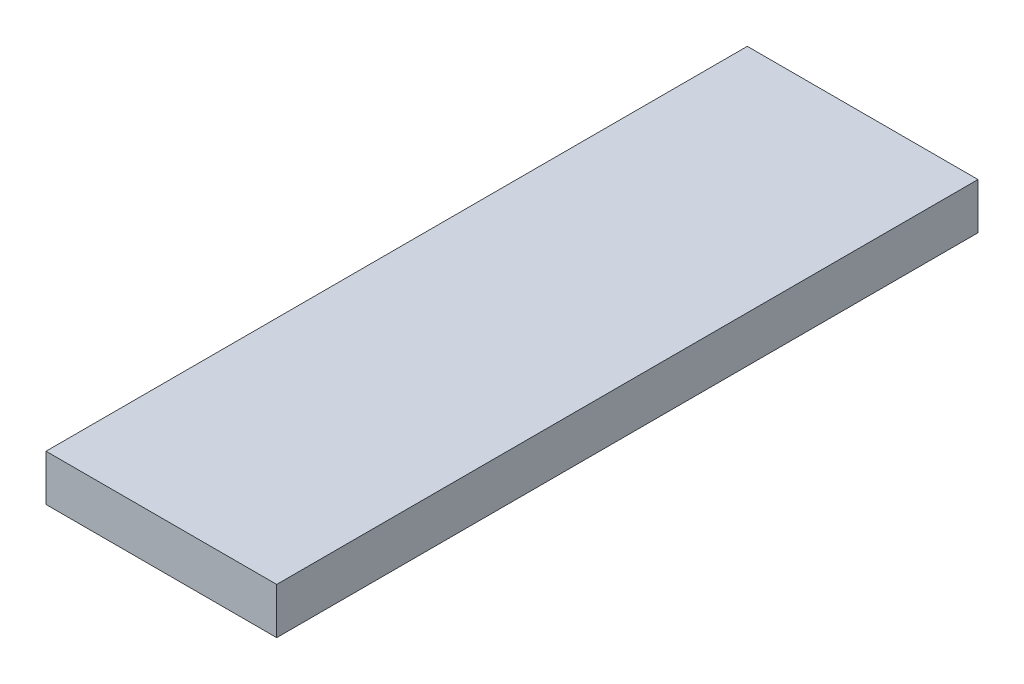
ISO-10303-21;
HEADER;
FILE_DESCRIPTION(('STEP AP214'),'2;1');
FILE_NAME('part.step','',(''),(''),'','','');
FILE_SCHEMA(('AUTOMOTIVE_DESIGN { 1 0 10303 214 1 1 1 1 }'));
ENDSEC;
DATA;
#1=APPLICATION_CONTEXT('core data for automotive mechanical design processes');
#2=APPLICATION_PROTOCOL_DEFINITION('international standard','automotive_design',2000,#1);
#3=PRODUCT_CONTEXT('',#1,'mechanical');
#4=PRODUCT('Part','Part','',(#3));
#5=PRODUCT_RELATED_PRODUCT_CATEGORY('part','',(#4));
#6=PRODUCT_DEFINITION_FORMATION('','',#4);
#7=PRODUCT_DEFINITION_CONTEXT('part definition',#1,'design');
#8=PRODUCT_DEFINITION('design','',#6,#7);
#9=PRODUCT_DEFINITION_SHAPE('','',#8);
#10=(LENGTH_UNIT() NAMED_UNIT(*) SI_UNIT(.MILLI.,.METRE.));
#11=(NAMED_UNIT(*) PLANE_ANGLE_UNIT() SI_UNIT($,.RADIAN.));
#12=(NAMED_UNIT(*) SI_UNIT($,.STERADIAN.) SOLID_ANGLE_UNIT());
#13=UNCERTAINTY_MEASURE_WITH_UNIT(LENGTH_MEASURE(1.E-05),#10,'distance_accuracy_value','');
#14=(GEOMETRIC_REPRESENTATION_CONTEXT(3) GLOBAL_UNCERTAINTY_ASSIGNED_CONTEXT((#13)) GLOBAL_UNIT_ASSIGNED_CONTEXT((#10,
#11,#12)) REPRESENTATION_CONTEXT('',''));
#15=CARTESIAN_POINT('',(0.,0.,0.));
#16=DIRECTION('',(0.,0.,1.));
#17=DIRECTION('',(1.,0.,0.));
#18=AXIS2_PLACEMENT_3D('',#15,#16,#17);
#19=CARTESIAN_POINT('',(50.,20.,151.999999999999));
#20=DIRECTION('',(-1.,0.,0.));
#21=DIRECTION('',(0.,0.,1.));
#22=AXIS2_PLACEMENT_3D('',#19,#20,#21);
#23=PLANE('',#22);
#24=DIRECTION('',(0.,0.,-1.));
#25=VECTOR('',#24,1.);
#26=CARTESIAN_POINT('',(50.,0.,152.));
#27=LINE('',#26,#25);
#28=CARTESIAN_POINT('',(50.,0.,152.));
#29=VERTEX_POINT('',#28);
#30=CARTESIAN_POINT('',(50.,0.,-152.));
#31=VERTEX_POINT('',#30);
#32=EDGE_CURVE('E116',#29,#31,#27,.T.);
#33=ORIENTED_EDGE('',*,*,#32,.T.);
#34=DIRECTION('',(0.,-1.,0.));
#35=VECTOR('',#34,1.);
#36=CARTESIAN_POINT('',(50.,20.,-152.000000000001));
#37=LINE('',#36,#35);
#38=CARTESIAN_POINT('',(50.,20.,-152.000000000001));
#39=VERTEX_POINT('',#38);
#40=EDGE_CURVE('E11',#39,#31,#37,.T.);
#41=ORIENTED_EDGE('',*,*,#40,.F.);
#42=DIRECTION('',(0.,0.,-1.));
#43=VECTOR('',#42,1.);
#44=CARTESIAN_POINT('',(50.,20.,151.999999999999));
#45=LINE('',#44,#43);
#46=CARTESIAN_POINT('',(50.,20.,151.999999999999));
#47=VERTEX_POINT('',#46);
#48=EDGE_CURVE('E99',#47,#39,#45,.T.);
#49=ORIENTED_EDGE('',*,*,#48,.F.);
#50=DIRECTION('',(0.,-1.,0.));
#51=VECTOR('',#50,1.);
#52=CARTESIAN_POINT('',(50.,20.,151.999999999999));
#53=LINE('',#52,#51);
#54=EDGE_CURVE('E112',#47,#29,#53,.T.);
#55=ORIENTED_EDGE('',*,*,#54,.T.);
#56=EDGE_LOOP('',(#33,#41,#49,#55));
#57=FACE_BOUND('',#56,.T.);
#58=ADVANCED_FACE('F47',(#57),#23,.F.);
#59=CARTESIAN_POINT('',(-50.,20.,-152.));
#60=DIRECTION('',(0.,0.,1.));
#61=DIRECTION('',(1.,0.,0.));
#62=AXIS2_PLACEMENT_3D('',#59,#60,#61);
#63=PLANE('',#62);
#64=DIRECTION('',(-1.,0.,0.));
#65=VECTOR('',#64,1.);
#66=CARTESIAN_POINT('',(-50.,0.,-152.000000000001));
#67=LINE('',#66,#65);
#68=CARTESIAN_POINT('',(-50.,0.,-152.000000000001));
#69=VERTEX_POINT('',#68);
#70=EDGE_CURVE('E104',#31,#69,#67,.T.);
#71=ORIENTED_EDGE('',*,*,#70,.T.);
#72=DIRECTION('',(0.,-1.,0.));
#73=VECTOR('',#72,1.);
#74=CARTESIAN_POINT('',(-50.,20.,-152.));
#75=LINE('',#74,#73);
#76=CARTESIAN_POINT('',(-50.,20.,-152.));
#77=VERTEX_POINT('',#76);
#78=EDGE_CURVE('E56',#77,#69,#75,.T.);
#79=ORIENTED_EDGE('',*,*,#78,.F.);
#80=DIRECTION('',(-1.,0.,0.));
#81=VECTOR('',#80,1.);
#82=CARTESIAN_POINT('',(-50.,20.,-152.));
#83=LINE('',#82,#81);
#84=EDGE_CURVE('E94',#39,#77,#83,.T.);
#85=ORIENTED_EDGE('',*,*,#84,.F.);
#86=ORIENTED_EDGE('',*,*,#40,.T.);
#87=EDGE_LOOP('',(#71,#79,#85,#86));
#88=FACE_BOUND('',#87,.T.);
#89=ADVANCED_FACE('F103',(#88),#63,.F.);
#90=CARTESIAN_POINT('',(-50.,20.,152.));
#91=DIRECTION('',(1.,0.,0.));
#92=DIRECTION('',(0.,0.,-1.));
#93=AXIS2_PLACEMENT_3D('',#90,#91,#92);
#94=PLANE('',#93);
#95=DIRECTION('',(0.,0.,1.));
#96=VECTOR('',#95,1.);
#97=CARTESIAN_POINT('',(-50.,0.,151.999999999999));
#98=LINE('',#97,#96);
#99=CARTESIAN_POINT('',(-50.,0.,151.999999999999));
#100=VERTEX_POINT('',#99);
#101=EDGE_CURVE('E81',#69,#100,#98,.T.);
#102=ORIENTED_EDGE('',*,*,#101,.T.);
#103=DIRECTION('',(0.,-1.,0.));
#104=VECTOR('',#103,1.);
#105=CARTESIAN_POINT('',(-50.,20.,152.));
#106=LINE('',#105,#104);
#107=CARTESIAN_POINT('',(-50.,20.,152.));
#108=VERTEX_POINT('',#107);
#109=EDGE_CURVE('E106',#108,#100,#106,.T.);
#110=ORIENTED_EDGE('',*,*,#109,.F.);
#111=DIRECTION('',(0.,0.,1.));
#112=VECTOR('',#111,1.);
#113=CARTESIAN_POINT('',(-50.,20.,152.));
#114=LINE('',#113,#112);
#115=EDGE_CURVE('E97',#77,#108,#114,.T.);
#116=ORIENTED_EDGE('',*,*,#115,.F.);
#117=ORIENTED_EDGE('',*,*,#78,.T.);
#118=EDGE_LOOP('',(#102,#110,#116,#117));
#119=FACE_BOUND('',#118,.T.);
#120=ADVANCED_FACE('F107',(#119),#94,.F.);
#121=CARTESIAN_POINT('',(-50.,20.,152.));
#122=DIRECTION('',(0.,0.,-1.));
#123=DIRECTION('',(-1.,0.,0.));
#124=AXIS2_PLACEMENT_3D('',#121,#122,#123);
#125=PLANE('',#124);
#126=DIRECTION('',(1.,0.,0.));
#127=VECTOR('',#126,1.);
#128=CARTESIAN_POINT('',(-50.,0.,151.999999999999));
#129=LINE('',#128,#127);
#130=EDGE_CURVE('E87',#100,#29,#129,.T.);
#131=ORIENTED_EDGE('',*,*,#130,.T.);
#132=ORIENTED_EDGE('',*,*,#54,.F.);
#133=DIRECTION('',(1.,0.,0.));
#134=VECTOR('',#133,1.);
#135=CARTESIAN_POINT('',(-50.,20.,152.));
#136=LINE('',#135,#134);
#137=EDGE_CURVE('E64',#108,#47,#136,.T.);
#138=ORIENTED_EDGE('',*,*,#137,.F.);
#139=ORIENTED_EDGE('',*,*,#109,.T.);
#140=EDGE_LOOP('',(#131,#132,#138,#139));
#141=FACE_BOUND('',#140,.T.);
#142=ADVANCED_FACE('F130',(#141),#125,.F.);
#143=CARTESIAN_POINT('',(0.,20.,0.));
#144=DIRECTION('',(0.,-1.,0.));
#145=DIRECTION('',(0.,0.,-1.));
#146=AXIS2_PLACEMENT_3D('',#143,#144,#145);
#147=PLANE('',#146);
#148=ORIENTED_EDGE('',*,*,#48,.T.);
#149=ORIENTED_EDGE('',*,*,#84,.T.);
#150=ORIENTED_EDGE('',*,*,#115,.T.);
#151=ORIENTED_EDGE('',*,*,#137,.T.);
#152=EDGE_LOOP('',(#148,#149,#150,#151));
#153=FACE_BOUND('',#152,.T.);
#154=ADVANCED_FACE('F95',(#153),#147,.F.);
#155=CARTESIAN_POINT('',(0.,0.,0.));
#156=DIRECTION('',(0.,-1.,0.));
#157=DIRECTION('',(0.,0.,-1.));
#158=AXIS2_PLACEMENT_3D('',#155,#156,#157);
#159=PLANE('',#158);
#160=ORIENTED_EDGE('',*,*,#32,.F.);
#161=ORIENTED_EDGE('',*,*,#130,.F.);
#162=ORIENTED_EDGE('',*,*,#101,.F.);
#163=ORIENTED_EDGE('',*,*,#70,.F.);
#164=EDGE_LOOP('',(#160,#161,#162,#163));
#165=FACE_BOUND('',#164,.T.);
#166=ADVANCED_FACE('F133',(#165),#159,.T.);
#167=CLOSED_SHELL('',(#58,#89,#120,#142,#154,#166));
#168=MANIFOLD_SOLID_BREP('B2',#167);
#169=ADVANCED_BREP_SHAPE_REPRESENTATION('',(#18,#168),#14);
#170=SHAPE_DEFINITION_REPRESENTATION(#9,#169);
ENDSEC;
END-ISO-10303-21;
